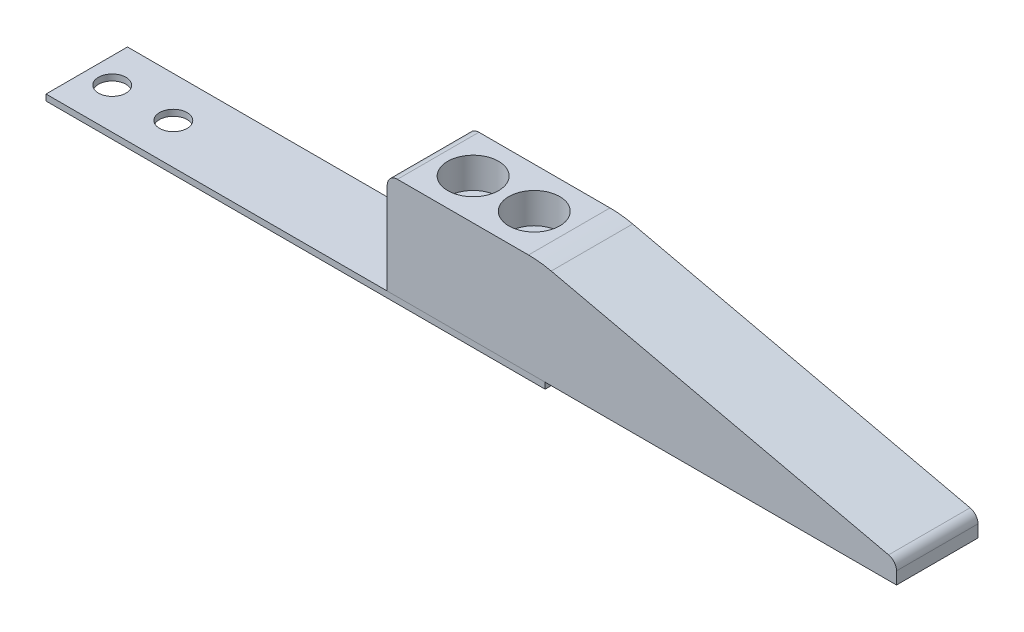
ISO-10303-21;
HEADER;
FILE_DESCRIPTION(('STEP AP214'),'2;1');
FILE_NAME('part.step','',(''),(''),'','','');
FILE_SCHEMA(('AUTOMOTIVE_DESIGN { 1 0 10303 214 1 1 1 1 }'));
ENDSEC;
DATA;
#1=APPLICATION_CONTEXT('core data for automotive mechanical design processes');
#2=APPLICATION_PROTOCOL_DEFINITION('international standard','automotive_design',2000,#1);
#3=PRODUCT_CONTEXT('',#1,'mechanical');
#4=PRODUCT('Part','Part','',(#3));
#5=PRODUCT_RELATED_PRODUCT_CATEGORY('part','',(#4));
#6=PRODUCT_DEFINITION_FORMATION('','',#4);
#7=PRODUCT_DEFINITION_CONTEXT('part definition',#1,'design');
#8=PRODUCT_DEFINITION('design','',#6,#7);
#9=PRODUCT_DEFINITION_SHAPE('','',#8);
#10=(LENGTH_UNIT() NAMED_UNIT(*) SI_UNIT(.MILLI.,.METRE.));
#11=(NAMED_UNIT(*) PLANE_ANGLE_UNIT() SI_UNIT($,.RADIAN.));
#12=(NAMED_UNIT(*) SI_UNIT($,.STERADIAN.) SOLID_ANGLE_UNIT());
#13=UNCERTAINTY_MEASURE_WITH_UNIT(LENGTH_MEASURE(1.E-05),#10,'distance_accuracy_value','');
#14=(GEOMETRIC_REPRESENTATION_CONTEXT(3) GLOBAL_UNCERTAINTY_ASSIGNED_CONTEXT((#13)) GLOBAL_UNIT_ASSIGNED_CONTEXT((#10,
#11,#12)) REPRESENTATION_CONTEXT('',''));
#15=CARTESIAN_POINT('',(0.,0.,0.));
#16=DIRECTION('',(0.,0.,1.));
#17=DIRECTION('',(1.,0.,0.));
#18=AXIS2_PLACEMENT_3D('',#15,#16,#17);
#19=CARTESIAN_POINT('',(43.9358461612297,0.,-4.));
#20=DIRECTION('',(0.,1.,0.));
#21=DIRECTION('',(0.,0.,1.));
#22=AXIS2_PLACEMENT_3D('',#19,#20,#21);
#23=CYLINDRICAL_SURFACE('',#22,1.35);
#24=CARTESIAN_POINT('',(43.9358461612297,0.6,-4.));
#25=DIRECTION('',(0.,-1.,0.));
#26=DIRECTION('',(0.,0.,-1.));
#27=AXIS2_PLACEMENT_3D('',#24,#25,#26);
#28=CIRCLE('',#27,1.35);
#29=CARTESIAN_POINT('',(43.9358461612297,0.6,-5.35));
#30=VERTEX_POINT('',#29);
#31=EDGE_CURVE('E188',#30,#30,#28,.T.);
#32=ORIENTED_EDGE('',*,*,#31,.T.);
#33=EDGE_LOOP('',(#32));
#34=FACE_BOUND('',#33,.T.);
#35=CARTESIAN_POINT('',(43.9358461612297,7.6,-4.));
#36=DIRECTION('',(0.,1.,0.));
#37=DIRECTION('',(0.,0.,1.));
#38=AXIS2_PLACEMENT_3D('',#35,#36,#37);
#39=CIRCLE('',#38,1.35);
#40=CARTESIAN_POINT('',(43.9358461612297,7.6,-2.65));
#41=VERTEX_POINT('',#40);
#42=EDGE_CURVE('E52',#41,#41,#39,.F.);
#43=ORIENTED_EDGE('',*,*,#42,.F.);
#44=EDGE_LOOP('',(#43));
#45=FACE_BOUND('',#44,.T.);
#46=ADVANCED_FACE('F48',(#34,#45),#23,.F.);
#47=CARTESIAN_POINT('',(37.9358461612297,0.,-4.));
#48=DIRECTION('',(0.,1.,0.));
#49=DIRECTION('',(0.,0.,1.));
#50=AXIS2_PLACEMENT_3D('',#47,#48,#49);
#51=CYLINDRICAL_SURFACE('',#50,1.35);
#52=CARTESIAN_POINT('',(37.9358461612297,0.6,-4.));
#53=DIRECTION('',(0.,-1.,0.));
#54=DIRECTION('',(0.,0.,-1.));
#55=AXIS2_PLACEMENT_3D('',#52,#53,#54);
#56=CIRCLE('',#55,1.35);
#57=CARTESIAN_POINT('',(37.9358461612297,0.6,-5.35));
#58=VERTEX_POINT('',#57);
#59=EDGE_CURVE('E145',#58,#58,#56,.T.);
#60=ORIENTED_EDGE('',*,*,#59,.T.);
#61=EDGE_LOOP('',(#60));
#62=FACE_BOUND('',#61,.T.);
#63=CARTESIAN_POINT('',(37.9358461612297,7.6,-4.));
#64=DIRECTION('',(0.,1.,0.));
#65=DIRECTION('',(0.,0.,1.));
#66=AXIS2_PLACEMENT_3D('',#63,#64,#65);
#67=CIRCLE('',#66,1.35);
#68=CARTESIAN_POINT('',(37.9358461612297,7.6,-2.65));
#69=VERTEX_POINT('',#68);
#70=EDGE_CURVE('E182',#69,#69,#67,.F.);
#71=ORIENTED_EDGE('',*,*,#70,.F.);
#72=EDGE_LOOP('',(#71));
#73=FACE_BOUND('',#72,.T.);
#74=ADVANCED_FACE('F208',(#62,#73),#51,.F.);
#75=CARTESIAN_POINT('',(83.5,0.6,-8.));
#76=DIRECTION('',(0.,-1.,0.));
#77=DIRECTION('',(0.,0.,-1.));
#78=AXIS2_PLACEMENT_3D('',#75,#76,#77);
#79=PLANE('',#78);
#80=ORIENTED_EDGE('',*,*,#59,.F.);
#81=EDGE_LOOP('',(#80));
#82=FACE_BOUND('',#81,.T.);
#83=ORIENTED_EDGE('',*,*,#31,.F.);
#84=EDGE_LOOP('',(#83));
#85=FACE_BOUND('',#84,.T.);
#86=DIRECTION('',(1.,0.,0.));
#87=VECTOR('',#86,1.);
#88=CARTESIAN_POINT('',(83.5,0.6,0.));
#89=LINE('',#88,#87);
#90=CARTESIAN_POINT('',(33.5,0.6,0.));
#91=VERTEX_POINT('',#90);
#92=CARTESIAN_POINT('',(83.5,0.6,0.));
#93=VERTEX_POINT('',#92);
#94=EDGE_CURVE('E154',#91,#93,#89,.T.);
#95=ORIENTED_EDGE('',*,*,#94,.F.);
#96=DIRECTION('',(0.,0.,1.));
#97=VECTOR('',#96,1.);
#98=CARTESIAN_POINT('',(33.5,0.6,-8.));
#99=LINE('',#98,#97);
#100=CARTESIAN_POINT('',(33.5,0.6,-8.));
#101=VERTEX_POINT('',#100);
#102=EDGE_CURVE('E125',#101,#91,#99,.T.);
#103=ORIENTED_EDGE('',*,*,#102,.F.);
#104=DIRECTION('',(1.,0.,0.));
#105=VECTOR('',#104,1.);
#106=CARTESIAN_POINT('',(83.5,0.6,-8.));
#107=LINE('',#106,#105);
#108=CARTESIAN_POINT('',(83.5,0.6,-8.));
#109=VERTEX_POINT('',#108);
#110=EDGE_CURVE('E131',#101,#109,#107,.T.);
#111=ORIENTED_EDGE('',*,*,#110,.T.);
#112=DIRECTION('',(0.,0.,1.));
#113=VECTOR('',#112,1.);
#114=CARTESIAN_POINT('',(83.5,0.6,-8.));
#115=LINE('',#114,#113);
#116=EDGE_CURVE('E113',#109,#93,#115,.T.);
#117=ORIENTED_EDGE('',*,*,#116,.T.);
#118=EDGE_LOOP('',(#95,#103,#111,#117));
#119=FACE_BOUND('',#118,.T.);
#120=ADVANCED_FACE('F138',(#82,#85,#119),#79,.T.);
#121=CARTESIAN_POINT('',(33.5,0.6,-8.));
#122=DIRECTION('',(-1.,0.,0.));
#123=DIRECTION('',(0.,0.,1.));
#124=AXIS2_PLACEMENT_3D('',#121,#122,#123);
#125=PLANE('',#124);
#126=DIRECTION('',(0.,-1.,0.));
#127=VECTOR('',#126,1.);
#128=CARTESIAN_POINT('',(33.5,0.6,0.));
#129=LINE('',#128,#127);
#130=CARTESIAN_POINT('',(33.5,9.6,0.));
#131=VERTEX_POINT('',#130);
#132=EDGE_CURVE('E140',#131,#91,#129,.T.);
#133=ORIENTED_EDGE('',*,*,#132,.F.);
#134=DIRECTION('',(0.,0.,1.));
#135=VECTOR('',#134,1.);
#136=CARTESIAN_POINT('',(33.5,9.6,-8.));
#137=LINE('',#136,#135);
#138=CARTESIAN_POINT('',(33.5,9.6,-8.));
#139=VERTEX_POINT('',#138);
#140=EDGE_CURVE('E57',#131,#139,#137,.F.);
#141=ORIENTED_EDGE('',*,*,#140,.T.);
#142=DIRECTION('',(0.,-1.,0.));
#143=VECTOR('',#142,1.);
#144=CARTESIAN_POINT('',(33.5,0.6,-8.));
#145=LINE('',#144,#143);
#146=EDGE_CURVE('E126',#139,#101,#145,.T.);
#147=ORIENTED_EDGE('',*,*,#146,.T.);
#148=ORIENTED_EDGE('',*,*,#102,.T.);
#149=EDGE_LOOP('',(#133,#141,#147,#148));
#150=FACE_BOUND('',#149,.T.);
#151=ADVANCED_FACE('F213',(#150),#125,.T.);
#152=CARTESIAN_POINT('',(33.5,10.6,-8.));
#153=DIRECTION('',(0.,1.,0.));
#154=DIRECTION('',(0.,0.,1.));
#155=AXIS2_PLACEMENT_3D('',#152,#153,#154);
#156=PLANE('',#155);
#157=CARTESIAN_POINT('',(37.9358461612297,10.6,-4.));
#158=DIRECTION('',(0.,1.,0.));
#159=DIRECTION('',(0.,0.,1.));
#160=AXIS2_PLACEMENT_3D('',#157,#158,#159);
#161=CIRCLE('',#160,2.5);
#162=CARTESIAN_POINT('',(37.9358461612297,10.6,-1.5));
#163=VERTEX_POINT('',#162);
#164=EDGE_CURVE('E190',#163,#163,#161,.T.);
#165=ORIENTED_EDGE('',*,*,#164,.F.);
#166=EDGE_LOOP('',(#165));
#167=FACE_BOUND('',#166,.T.);
#168=CARTESIAN_POINT('',(43.9358461612297,10.6,-4.));
#169=DIRECTION('',(0.,1.,0.));
#170=DIRECTION('',(0.,0.,1.));
#171=AXIS2_PLACEMENT_3D('',#168,#169,#170);
#172=CIRCLE('',#171,2.5);
#173=CARTESIAN_POINT('',(43.9358461612297,10.6,-1.5));
#174=VERTEX_POINT('',#173);
#175=EDGE_CURVE('E200',#174,#174,#172,.T.);
#176=ORIENTED_EDGE('',*,*,#175,.F.);
#177=EDGE_LOOP('',(#176));
#178=FACE_BOUND('',#177,.T.);
#179=DIRECTION('',(-1.,0.,0.));
#180=VECTOR('',#179,1.);
#181=CARTESIAN_POINT('',(33.5,10.6,-8.));
#182=LINE('',#181,#180);
#183=CARTESIAN_POINT('',(47.3716923224594,10.6,-8.));
#184=VERTEX_POINT('',#183);
#185=CARTESIAN_POINT('',(34.5,10.6,-8.));
#186=VERTEX_POINT('',#185);
#187=EDGE_CURVE('E150',#184,#186,#182,.T.);
#188=ORIENTED_EDGE('',*,*,#187,.T.);
#189=DIRECTION('',(0.,0.,1.));
#190=VECTOR('',#189,1.);
#191=CARTESIAN_POINT('',(34.5,10.6,-8.));
#192=LINE('',#191,#190);
#193=CARTESIAN_POINT('',(34.5,10.6,0.));
#194=VERTEX_POINT('',#193);
#195=EDGE_CURVE('E178',#186,#194,#192,.T.);
#196=ORIENTED_EDGE('',*,*,#195,.T.);
#197=DIRECTION('',(-1.,0.,0.));
#198=VECTOR('',#197,1.);
#199=CARTESIAN_POINT('',(33.5,10.6,0.));
#200=LINE('',#199,#198);
#201=CARTESIAN_POINT('',(47.3716923224594,10.6,0.));
#202=VERTEX_POINT('',#201);
#203=EDGE_CURVE('E142',#202,#194,#200,.T.);
#204=ORIENTED_EDGE('',*,*,#203,.F.);
#205=DIRECTION('',(0.,0.,1.));
#206=VECTOR('',#205,1.);
#207=CARTESIAN_POINT('',(47.3716923224594,10.6,-8.));
#208=LINE('',#207,#206);
#209=EDGE_CURVE('E174',#202,#184,#208,.F.);
#210=ORIENTED_EDGE('',*,*,#209,.T.);
#211=EDGE_LOOP('',(#188,#196,#204,#210));
#212=FACE_BOUND('',#211,.T.);
#213=ADVANCED_FACE('F219',(#167,#178,#212),#156,.T.);
#214=CARTESIAN_POINT('',(83.5,2.6,-8.));
#215=DIRECTION('',(0.222824801502141,0.974858506571867,0.));
#216=DIRECTION('',(-0.974858506571867,0.222824801502141,0.));
#217=AXIS2_PLACEMENT_3D('',#214,#215,#216);
#218=PLANE('',#217);
#219=DIRECTION('',(-0.974858506571867,0.222824801502141,0.));
#220=VECTOR('',#219,1.);
#221=CARTESIAN_POINT('',(83.5,2.6,-8.));
#222=LINE('',#221,#220);
#223=CARTESIAN_POINT('',(82.7228248015021,2.77764004537094,-8.));
#224=VERTEX_POINT('',#223);
#225=CARTESIAN_POINT('',(49.5999403374808,10.3485850657187,-8.));
#226=VERTEX_POINT('',#225);
#227=EDGE_CURVE('E135',#224,#226,#222,.T.);
#228=ORIENTED_EDGE('',*,*,#227,.T.);
#229=DIRECTION('',(0.,0.,1.));
#230=VECTOR('',#229,1.);
#231=CARTESIAN_POINT('',(49.5999403374808,10.3485850657187,-8.));
#232=LINE('',#231,#230);
#233=CARTESIAN_POINT('',(49.5999403374808,10.3485850657187,0.));
#234=VERTEX_POINT('',#233);
#235=EDGE_CURVE('E169',#226,#234,#232,.T.);
#236=ORIENTED_EDGE('',*,*,#235,.T.);
#237=DIRECTION('',(-0.974858506571867,0.222824801502141,0.));
#238=VECTOR('',#237,1.);
#239=CARTESIAN_POINT('',(83.5,2.6,0.));
#240=LINE('',#239,#238);
#241=CARTESIAN_POINT('',(82.7228248015021,2.77764004537094,0.));
#242=VERTEX_POINT('',#241);
#243=EDGE_CURVE('E157',#242,#234,#240,.T.);
#244=ORIENTED_EDGE('',*,*,#243,.F.);
#245=DIRECTION('',(0.,0.,1.));
#246=VECTOR('',#245,1.);
#247=CARTESIAN_POINT('',(82.7228248015021,2.77764004537094,-8.));
#248=LINE('',#247,#246);
#249=EDGE_CURVE('E166',#242,#224,#248,.F.);
#250=ORIENTED_EDGE('',*,*,#249,.T.);
#251=EDGE_LOOP('',(#228,#236,#244,#250));
#252=FACE_BOUND('',#251,.T.);
#253=ADVANCED_FACE('F239',(#252),#218,.T.);
#254=CARTESIAN_POINT('',(83.5,0.6,-8.));
#255=DIRECTION('',(1.,0.,0.));
#256=DIRECTION('',(0.,0.,-1.));
#257=AXIS2_PLACEMENT_3D('',#254,#255,#256);
#258=PLANE('',#257);
#259=DIRECTION('',(0.,1.,0.));
#260=VECTOR('',#259,1.);
#261=CARTESIAN_POINT('',(83.5,0.6,-8.));
#262=LINE('',#261,#260);
#263=CARTESIAN_POINT('',(83.5,1.80278153879907,-8.));
#264=VERTEX_POINT('',#263);
#265=EDGE_CURVE('E117',#109,#264,#262,.T.);
#266=ORIENTED_EDGE('',*,*,#265,.T.);
#267=DIRECTION('',(0.,0.,1.));
#268=VECTOR('',#267,1.);
#269=CARTESIAN_POINT('',(83.5,1.80278153879907,-8.));
#270=LINE('',#269,#268);
#271=CARTESIAN_POINT('',(83.5,1.80278153879907,0.));
#272=VERTEX_POINT('',#271);
#273=EDGE_CURVE('E161',#264,#272,#270,.T.);
#274=ORIENTED_EDGE('',*,*,#273,.T.);
#275=DIRECTION('',(0.,1.,0.));
#276=VECTOR('',#275,1.);
#277=CARTESIAN_POINT('',(83.5,0.6,0.));
#278=LINE('',#277,#276);
#279=EDGE_CURVE('E120',#93,#272,#278,.T.);
#280=ORIENTED_EDGE('',*,*,#279,.F.);
#281=ORIENTED_EDGE('',*,*,#116,.F.);
#282=EDGE_LOOP('',(#266,#274,#280,#281));
#283=FACE_BOUND('',#282,.T.);
#284=ADVANCED_FACE('F115',(#283),#258,.T.);
#285=CARTESIAN_POINT('',(0.,0.,-8.));
#286=DIRECTION('',(0.,0.,-1.));
#287=DIRECTION('',(-1.,0.,0.));
#288=AXIS2_PLACEMENT_3D('',#285,#286,#287);
#289=PLANE('',#288);
#290=ORIENTED_EDGE('',*,*,#146,.F.);
#291=CARTESIAN_POINT('',(34.5,9.6,-8.));
#292=DIRECTION('',(0.,0.,-1.));
#293=DIRECTION('',(-1.,0.,0.));
#294=AXIS2_PLACEMENT_3D('',#291,#292,#293);
#295=CIRCLE('',#294,1.);
#296=EDGE_CURVE('E12',#139,#186,#295,.T.);
#297=ORIENTED_EDGE('',*,*,#296,.T.);
#298=ORIENTED_EDGE('',*,*,#187,.F.);
#299=CARTESIAN_POINT('',(47.3716923224594,0.599999999999999,-8.));
#300=DIRECTION('',(0.,0.,-1.));
#301=DIRECTION('',(-1.,0.,0.));
#302=AXIS2_PLACEMENT_3D('',#299,#300,#301);
#303=CIRCLE('',#302,10.);
#304=EDGE_CURVE('E176',#184,#226,#303,.T.);
#305=ORIENTED_EDGE('',*,*,#304,.T.);
#306=ORIENTED_EDGE('',*,*,#227,.F.);
#307=CARTESIAN_POINT('',(82.5,1.80278153879907,-8.));
#308=DIRECTION('',(0.,0.,-1.));
#309=DIRECTION('',(-1.,0.,0.));
#310=AXIS2_PLACEMENT_3D('',#307,#308,#309);
#311=CIRCLE('',#310,1.);
#312=EDGE_CURVE('E134',#224,#264,#311,.T.);
#313=ORIENTED_EDGE('',*,*,#312,.T.);
#314=ORIENTED_EDGE('',*,*,#265,.F.);
#315=ORIENTED_EDGE('',*,*,#110,.F.);
#316=EDGE_LOOP('',(#290,#297,#298,#305,#306,#313,#314,#315));
#317=FACE_BOUND('',#316,.T.);
#318=ADVANCED_FACE('F130',(#317),#289,.T.);
#319=CARTESIAN_POINT('',(0.,0.,0.));
#320=DIRECTION('',(0.,0.,-1.));
#321=DIRECTION('',(-1.,0.,0.));
#322=AXIS2_PLACEMENT_3D('',#319,#320,#321);
#323=PLANE('',#322);
#324=ORIENTED_EDGE('',*,*,#203,.T.);
#325=CARTESIAN_POINT('',(34.5,9.6,0.));
#326=DIRECTION('',(0.,0.,-1.));
#327=DIRECTION('',(-1.,0.,0.));
#328=AXIS2_PLACEMENT_3D('',#325,#326,#327);
#329=CIRCLE('',#328,1.);
#330=EDGE_CURVE('E72',#194,#131,#329,.F.);
#331=ORIENTED_EDGE('',*,*,#330,.T.);
#332=ORIENTED_EDGE('',*,*,#132,.T.);
#333=ORIENTED_EDGE('',*,*,#94,.T.);
#334=ORIENTED_EDGE('',*,*,#279,.T.);
#335=CARTESIAN_POINT('',(82.5,1.80278153879907,0.));
#336=DIRECTION('',(0.,0.,-1.));
#337=DIRECTION('',(-1.,0.,0.));
#338=AXIS2_PLACEMENT_3D('',#335,#336,#337);
#339=CIRCLE('',#338,1.);
#340=EDGE_CURVE('E164',#272,#242,#339,.F.);
#341=ORIENTED_EDGE('',*,*,#340,.T.);
#342=ORIENTED_EDGE('',*,*,#243,.T.);
#343=CARTESIAN_POINT('',(47.3716923224594,0.599999999999999,0.));
#344=DIRECTION('',(0.,0.,-1.));
#345=DIRECTION('',(-1.,0.,0.));
#346=AXIS2_PLACEMENT_3D('',#343,#344,#345);
#347=CIRCLE('',#346,10.);
#348=EDGE_CURVE('E172',#234,#202,#347,.F.);
#349=ORIENTED_EDGE('',*,*,#348,.T.);
#350=EDGE_LOOP('',(#324,#331,#332,#333,#334,#341,#342,#349));
#351=FACE_BOUND('',#350,.T.);
#352=ADVANCED_FACE('F233',(#351),#323,.F.);
#353=CARTESIAN_POINT('',(82.5,1.80278153879907,-8.));
#354=DIRECTION('',(0.,0.,1.));
#355=DIRECTION('',(1.,0.,0.));
#356=AXIS2_PLACEMENT_3D('',#353,#354,#355);
#357=CYLINDRICAL_SURFACE('',#356,1.);
#358=ORIENTED_EDGE('',*,*,#312,.F.);
#359=ORIENTED_EDGE('',*,*,#249,.F.);
#360=ORIENTED_EDGE('',*,*,#340,.F.);
#361=ORIENTED_EDGE('',*,*,#273,.F.);
#362=EDGE_LOOP('',(#358,#359,#360,#361));
#363=FACE_BOUND('',#362,.T.);
#364=ADVANCED_FACE('F235',(#363),#357,.T.);
#365=CARTESIAN_POINT('',(47.3716923224594,0.599999999999999,-8.));
#366=DIRECTION('',(0.,0.,1.));
#367=DIRECTION('',(1.,0.,0.));
#368=AXIS2_PLACEMENT_3D('',#365,#366,#367);
#369=CYLINDRICAL_SURFACE('',#368,10.);
#370=ORIENTED_EDGE('',*,*,#304,.F.);
#371=ORIENTED_EDGE('',*,*,#209,.F.);
#372=ORIENTED_EDGE('',*,*,#348,.F.);
#373=ORIENTED_EDGE('',*,*,#235,.F.);
#374=EDGE_LOOP('',(#370,#371,#372,#373));
#375=FACE_BOUND('',#374,.T.);
#376=ADVANCED_FACE('F264',(#375),#369,.T.);
#377=CARTESIAN_POINT('',(34.5,9.6,-8.));
#378=DIRECTION('',(0.,0.,1.));
#379=DIRECTION('',(1.,0.,0.));
#380=AXIS2_PLACEMENT_3D('',#377,#378,#379);
#381=CYLINDRICAL_SURFACE('',#380,1.);
#382=ORIENTED_EDGE('',*,*,#296,.F.);
#383=ORIENTED_EDGE('',*,*,#140,.F.);
#384=ORIENTED_EDGE('',*,*,#330,.F.);
#385=ORIENTED_EDGE('',*,*,#195,.F.);
#386=EDGE_LOOP('',(#382,#383,#384,#385));
#387=FACE_BOUND('',#386,.T.);
#388=ADVANCED_FACE('F50',(#387),#381,.T.);
#389=CARTESIAN_POINT('',(37.9358461612297,7.6,-4.));
#390=DIRECTION('',(0.,1.,0.));
#391=DIRECTION('',(0.,0.,1.));
#392=AXIS2_PLACEMENT_3D('',#389,#390,#391);
#393=PLANE('',#392);
#394=CARTESIAN_POINT('',(37.9358461612297,7.6,-4.));
#395=DIRECTION('',(0.,1.,0.));
#396=DIRECTION('',(0.,0.,1.));
#397=AXIS2_PLACEMENT_3D('',#394,#395,#396);
#398=CIRCLE('',#397,2.5);
#399=CARTESIAN_POINT('',(37.9358461612297,7.6,-1.5));
#400=VERTEX_POINT('',#399);
#401=EDGE_CURVE('E184',#400,#400,#398,.T.);
#402=ORIENTED_EDGE('',*,*,#401,.T.);
#403=EDGE_LOOP('',(#402));
#404=FACE_BOUND('',#403,.T.);
#405=ORIENTED_EDGE('',*,*,#70,.T.);
#406=EDGE_LOOP('',(#405));
#407=FACE_BOUND('',#406,.T.);
#408=ADVANCED_FACE('F276',(#404,#407),#393,.T.);
#409=CARTESIAN_POINT('',(37.9358461612297,7.6,-4.));
#410=DIRECTION('',(0.,1.,0.));
#411=DIRECTION('',(0.,0.,1.));
#412=AXIS2_PLACEMENT_3D('',#409,#410,#411);
#413=CYLINDRICAL_SURFACE('',#412,2.5);
#414=ORIENTED_EDGE('',*,*,#401,.F.);
#415=EDGE_LOOP('',(#414));
#416=FACE_BOUND('',#415,.T.);
#417=ORIENTED_EDGE('',*,*,#164,.T.);
#418=EDGE_LOOP('',(#417));
#419=FACE_BOUND('',#418,.T.);
#420=ADVANCED_FACE('F283',(#416,#419),#413,.F.);
#421=CARTESIAN_POINT('',(43.9358461612297,7.6,-4.));
#422=DIRECTION('',(0.,1.,0.));
#423=DIRECTION('',(0.,0.,1.));
#424=AXIS2_PLACEMENT_3D('',#421,#422,#423);
#425=PLANE('',#424);
#426=CARTESIAN_POINT('',(43.9358461612297,7.6,-4.));
#427=DIRECTION('',(0.,1.,0.));
#428=DIRECTION('',(0.,0.,1.));
#429=AXIS2_PLACEMENT_3D('',#426,#427,#428);
#430=CIRCLE('',#429,2.5);
#431=CARTESIAN_POINT('',(43.9358461612297,7.6,-1.5));
#432=VERTEX_POINT('',#431);
#433=EDGE_CURVE('E195',#432,#432,#430,.T.);
#434=ORIENTED_EDGE('',*,*,#433,.T.);
#435=EDGE_LOOP('',(#434));
#436=FACE_BOUND('',#435,.T.);
#437=ORIENTED_EDGE('',*,*,#42,.T.);
#438=EDGE_LOOP('',(#437));
#439=FACE_BOUND('',#438,.T.);
#440=ADVANCED_FACE('F291',(#436,#439),#425,.T.);
#441=CARTESIAN_POINT('',(43.9358461612297,7.6,-4.));
#442=DIRECTION('',(0.,1.,0.));
#443=DIRECTION('',(0.,0.,1.));
#444=AXIS2_PLACEMENT_3D('',#441,#442,#443);
#445=CYLINDRICAL_SURFACE('',#444,2.5);
#446=ORIENTED_EDGE('',*,*,#433,.F.);
#447=EDGE_LOOP('',(#446));
#448=FACE_BOUND('',#447,.T.);
#449=ORIENTED_EDGE('',*,*,#175,.T.);
#450=EDGE_LOOP('',(#449));
#451=FACE_BOUND('',#450,.T.);
#452=ADVANCED_FACE('F299',(#448,#451),#445,.F.);
#453=CLOSED_SHELL('',(#46,#74,#120,#151,#213,#253,#284,#318,#352,#364,#376,#388,#408,#420,#440,#452));
#454=MANIFOLD_SOLID_BREP('B2',#453);
#455=CARTESIAN_POINT('',(0.,0.6,0.));
#456=DIRECTION('',(0.,-1.,0.));
#457=DIRECTION('',(0.,0.,-1.));
#458=AXIS2_PLACEMENT_3D('',#455,#456,#457);
#459=PLANE('',#458);
#460=CARTESIAN_POINT('',(37.9358461612297,0.6,-4.));
#461=DIRECTION('',(0.,-1.,0.));
#462=DIRECTION('',(0.,0.,-1.));
#463=AXIS2_PLACEMENT_3D('',#460,#461,#462);
#464=CIRCLE('',#463,1.35);
#465=CARTESIAN_POINT('',(37.9358461612297,0.6,-5.35));
#466=VERTEX_POINT('',#465);
#467=EDGE_CURVE('E465',#466,#466,#464,.T.);
#468=ORIENTED_EDGE('',*,*,#467,.T.);
#469=EDGE_LOOP('',(#468));
#470=FACE_BOUND('',#469,.T.);
#471=CARTESIAN_POINT('',(43.9358461612297,0.6,-4.));
#472=DIRECTION('',(0.,-1.,0.));
#473=DIRECTION('',(0.,0.,-1.));
#474=AXIS2_PLACEMENT_3D('',#471,#472,#473);
#475=CIRCLE('',#474,1.35);
#476=CARTESIAN_POINT('',(43.9358461612297,0.6,-5.35));
#477=VERTEX_POINT('',#476);
#478=EDGE_CURVE('E470',#477,#477,#475,.T.);
#479=ORIENTED_EDGE('',*,*,#478,.T.);
#480=EDGE_LOOP('',(#479));
#481=FACE_BOUND('',#480,.T.);
#482=DIRECTION('',(0.,0.,1.));
#483=VECTOR('',#482,1.);
#484=CARTESIAN_POINT('',(0.,0.6,0.));
#485=LINE('',#484,#483);
#486=CARTESIAN_POINT('',(0.,0.6,-8.));
#487=VERTEX_POINT('',#486);
#488=CARTESIAN_POINT('',(0.,0.6,0.));
#489=VERTEX_POINT('',#488);
#490=EDGE_CURVE('E429',#487,#489,#485,.T.);
#491=ORIENTED_EDGE('',*,*,#490,.T.);
#492=DIRECTION('',(1.,0.,0.));
#493=VECTOR('',#492,1.);
#494=CARTESIAN_POINT('',(0.,0.6,0.));
#495=LINE('',#494,#493);
#496=CARTESIAN_POINT('',(49.,0.6,0.));
#497=VERTEX_POINT('',#496);
#498=EDGE_CURVE('E424',#489,#497,#495,.T.);
#499=ORIENTED_EDGE('',*,*,#498,.T.);
#500=DIRECTION('',(0.,0.,-1.));
#501=VECTOR('',#500,1.);
#502=CARTESIAN_POINT('',(49.,0.6,0.));
#503=LINE('',#502,#501);
#504=CARTESIAN_POINT('',(49.,0.6,-8.));
#505=VERTEX_POINT('',#504);
#506=EDGE_CURVE('E427',#497,#505,#503,.T.);
#507=ORIENTED_EDGE('',*,*,#506,.T.);
#508=DIRECTION('',(-1.,0.,0.));
#509=VECTOR('',#508,1.);
#510=CARTESIAN_POINT('',(0.,0.6,-8.));
#511=LINE('',#510,#509);
#512=EDGE_CURVE('E394',#505,#487,#511,.T.);
#513=ORIENTED_EDGE('',*,*,#512,.T.);
#514=EDGE_LOOP('',(#491,#499,#507,#513));
#515=FACE_BOUND('',#514,.T.);
#516=CARTESIAN_POINT('',(2.5,0.6,-4.));
#517=DIRECTION('',(0.,1.,0.));
#518=DIRECTION('',(0.,0.,1.));
#519=AXIS2_PLACEMENT_3D('',#516,#517,#518);
#520=CIRCLE('',#519,1.35);
#521=CARTESIAN_POINT('',(2.5,0.6,-2.65));
#522=VERTEX_POINT('',#521);
#523=EDGE_CURVE('E444',#522,#522,#520,.T.);
#524=ORIENTED_EDGE('',*,*,#523,.F.);
#525=EDGE_LOOP('',(#524));
#526=FACE_BOUND('',#525,.T.);
#527=CARTESIAN_POINT('',(8.5,0.6,-4.));
#528=DIRECTION('',(0.,1.,0.));
#529=DIRECTION('',(0.,0.,1.));
#530=AXIS2_PLACEMENT_3D('',#527,#528,#529);
#531=CIRCLE('',#530,1.35);
#532=CARTESIAN_POINT('',(8.5,0.6,-2.65));
#533=VERTEX_POINT('',#532);
#534=EDGE_CURVE('E459',#533,#533,#531,.T.);
#535=ORIENTED_EDGE('',*,*,#534,.F.);
#536=EDGE_LOOP('',(#535));
#537=FACE_BOUND('',#536,.T.);
#538=ADVANCED_FACE('F377',(#470,#481,#515,#526,#537),#459,.F.);
#539=CARTESIAN_POINT('',(0.,0.,0.));
#540=DIRECTION('',(0.,-1.,0.));
#541=DIRECTION('',(0.,0.,-1.));
#542=AXIS2_PLACEMENT_3D('',#539,#540,#541);
#543=PLANE('',#542);
#544=CARTESIAN_POINT('',(37.9358461612297,0.,-4.));
#545=DIRECTION('',(0.,1.,0.));
#546=DIRECTION('',(0.,0.,1.));
#547=AXIS2_PLACEMENT_3D('',#544,#545,#546);
#548=CIRCLE('',#547,1.35);
#549=CARTESIAN_POINT('',(37.9358461612297,0.,-2.65));
#550=VERTEX_POINT('',#549);
#551=EDGE_CURVE('E473',#550,#550,#548,.T.);
#552=ORIENTED_EDGE('',*,*,#551,.T.);
#553=EDGE_LOOP('',(#552));
#554=FACE_BOUND('',#553,.T.);
#555=CARTESIAN_POINT('',(43.9358461612297,0.,-4.));
#556=DIRECTION('',(0.,1.,0.));
#557=DIRECTION('',(0.,0.,-1.));
#558=AXIS2_PLACEMENT_3D('',#555,#556,#557);
#559=CIRCLE('',#558,1.35);
#560=CARTESIAN_POINT('',(43.9358461612297,0.,-5.35));
#561=VERTEX_POINT('',#560);
#562=EDGE_CURVE('E474',#561,#561,#559,.T.);
#563=ORIENTED_EDGE('',*,*,#562,.T.);
#564=EDGE_LOOP('',(#563));
#565=FACE_BOUND('',#564,.T.);
#566=CARTESIAN_POINT('',(2.5,0.,-4.));
#567=DIRECTION('',(0.,1.,0.));
#568=DIRECTION('',(0.,0.,1.));
#569=AXIS2_PLACEMENT_3D('',#566,#567,#568);
#570=CIRCLE('',#569,1.35);
#571=CARTESIAN_POINT('',(2.5,0.,-2.65));
#572=VERTEX_POINT('',#571);
#573=EDGE_CURVE('E456',#572,#572,#570,.T.);
#574=ORIENTED_EDGE('',*,*,#573,.T.);
#575=EDGE_LOOP('',(#574));
#576=FACE_BOUND('',#575,.T.);
#577=DIRECTION('',(0.,0.,1.));
#578=VECTOR('',#577,1.);
#579=CARTESIAN_POINT('',(0.,0.,0.));
#580=LINE('',#579,#578);
#581=CARTESIAN_POINT('',(0.,0.,-8.));
#582=VERTEX_POINT('',#581);
#583=CARTESIAN_POINT('',(0.,0.,0.));
#584=VERTEX_POINT('',#583);
#585=EDGE_CURVE('E441',#582,#584,#580,.T.);
#586=ORIENTED_EDGE('',*,*,#585,.F.);
#587=DIRECTION('',(-1.,0.,0.));
#588=VECTOR('',#587,1.);
#589=CARTESIAN_POINT('',(0.,0.,-8.));
#590=LINE('',#589,#588);
#591=CARTESIAN_POINT('',(49.,0.,-8.));
#592=VERTEX_POINT('',#591);
#593=EDGE_CURVE('E417',#592,#582,#590,.T.);
#594=ORIENTED_EDGE('',*,*,#593,.F.);
#595=DIRECTION('',(0.,0.,-1.));
#596=VECTOR('',#595,1.);
#597=CARTESIAN_POINT('',(49.,0.,0.));
#598=LINE('',#597,#596);
#599=CARTESIAN_POINT('',(49.,0.,0.));
#600=VERTEX_POINT('',#599);
#601=EDGE_CURVE('E411',#600,#592,#598,.T.);
#602=ORIENTED_EDGE('',*,*,#601,.F.);
#603=DIRECTION('',(1.,0.,0.));
#604=VECTOR('',#603,1.);
#605=CARTESIAN_POINT('',(0.,0.,0.));
#606=LINE('',#605,#604);
#607=EDGE_CURVE('E433',#584,#600,#606,.T.);
#608=ORIENTED_EDGE('',*,*,#607,.F.);
#609=EDGE_LOOP('',(#586,#594,#602,#608));
#610=FACE_BOUND('',#609,.T.);
#611=CARTESIAN_POINT('',(8.5,0.,-4.));
#612=DIRECTION('',(0.,1.,0.));
#613=DIRECTION('',(0.,0.,1.));
#614=AXIS2_PLACEMENT_3D('',#611,#612,#613);
#615=CIRCLE('',#614,1.35);
#616=CARTESIAN_POINT('',(8.5,0.,-2.65));
#617=VERTEX_POINT('',#616);
#618=EDGE_CURVE('E462',#617,#617,#615,.T.);
#619=ORIENTED_EDGE('',*,*,#618,.T.);
#620=EDGE_LOOP('',(#619));
#621=FACE_BOUND('',#620,.T.);
#622=ADVANCED_FACE('F452',(#554,#565,#576,#610,#621),#543,.T.);
#623=CARTESIAN_POINT('',(0.,0.6,0.));
#624=DIRECTION('',(1.,0.,0.));
#625=DIRECTION('',(0.,0.,-1.));
#626=AXIS2_PLACEMENT_3D('',#623,#624,#625);
#627=PLANE('',#626);
#628=ORIENTED_EDGE('',*,*,#585,.T.);
#629=DIRECTION('',(0.,-1.,0.));
#630=VECTOR('',#629,1.);
#631=CARTESIAN_POINT('',(0.,0.6,0.));
#632=LINE('',#631,#630);
#633=EDGE_CURVE('E46',#489,#584,#632,.T.);
#634=ORIENTED_EDGE('',*,*,#633,.F.);
#635=ORIENTED_EDGE('',*,*,#490,.F.);
#636=DIRECTION('',(0.,-1.,0.));
#637=VECTOR('',#636,1.);
#638=CARTESIAN_POINT('',(0.,0.6,-8.));
#639=LINE('',#638,#637);
#640=EDGE_CURVE('E437',#487,#582,#639,.T.);
#641=ORIENTED_EDGE('',*,*,#640,.T.);
#642=EDGE_LOOP('',(#628,#634,#635,#641));
#643=FACE_BOUND('',#642,.T.);
#644=ADVANCED_FACE('F379',(#643),#627,.F.);
#645=CARTESIAN_POINT('',(0.,0.6,0.));
#646=DIRECTION('',(0.,0.,-1.));
#647=DIRECTION('',(-1.,0.,0.));
#648=AXIS2_PLACEMENT_3D('',#645,#646,#647);
#649=PLANE('',#648);
#650=ORIENTED_EDGE('',*,*,#607,.T.);
#651=DIRECTION('',(0.,-1.,0.));
#652=VECTOR('',#651,1.);
#653=CARTESIAN_POINT('',(49.,0.6,0.));
#654=LINE('',#653,#652);
#655=EDGE_CURVE('E386',#497,#600,#654,.T.);
#656=ORIENTED_EDGE('',*,*,#655,.F.);
#657=ORIENTED_EDGE('',*,*,#498,.F.);
#658=ORIENTED_EDGE('',*,*,#633,.T.);
#659=EDGE_LOOP('',(#650,#656,#657,#658));
#660=FACE_BOUND('',#659,.T.);
#661=ADVANCED_FACE('F432',(#660),#649,.F.);
#662=CARTESIAN_POINT('',(49.,0.6,0.));
#663=DIRECTION('',(-1.,0.,0.));
#664=DIRECTION('',(0.,0.,1.));
#665=AXIS2_PLACEMENT_3D('',#662,#663,#664);
#666=PLANE('',#665);
#667=ORIENTED_EDGE('',*,*,#601,.T.);
#668=DIRECTION('',(0.,-1.,0.));
#669=VECTOR('',#668,1.);
#670=CARTESIAN_POINT('',(49.,0.6,-8.));
#671=LINE('',#670,#669);
#672=EDGE_CURVE('E434',#505,#592,#671,.T.);
#673=ORIENTED_EDGE('',*,*,#672,.F.);
#674=ORIENTED_EDGE('',*,*,#506,.F.);
#675=ORIENTED_EDGE('',*,*,#655,.T.);
#676=EDGE_LOOP('',(#667,#673,#674,#675));
#677=FACE_BOUND('',#676,.T.);
#678=ADVANCED_FACE('F435',(#677),#666,.F.);
#679=CARTESIAN_POINT('',(0.,0.6,-8.));
#680=DIRECTION('',(0.,0.,1.));
#681=DIRECTION('',(1.,0.,0.));
#682=AXIS2_PLACEMENT_3D('',#679,#680,#681);
#683=PLANE('',#682);
#684=ORIENTED_EDGE('',*,*,#593,.T.);
#685=ORIENTED_EDGE('',*,*,#640,.F.);
#686=ORIENTED_EDGE('',*,*,#512,.F.);
#687=ORIENTED_EDGE('',*,*,#672,.T.);
#688=EDGE_LOOP('',(#684,#685,#686,#687));
#689=FACE_BOUND('',#688,.T.);
#690=ADVANCED_FACE('F449',(#689),#683,.F.);
#691=CARTESIAN_POINT('',(2.5,0.6,-4.));
#692=DIRECTION('',(0.,-1.,0.));
#693=DIRECTION('',(0.,0.,-1.));
#694=AXIS2_PLACEMENT_3D('',#691,#692,#693);
#695=CYLINDRICAL_SURFACE('',#694,1.35);
#696=ORIENTED_EDGE('',*,*,#523,.T.);
#697=EDGE_LOOP('',(#696));
#698=FACE_BOUND('',#697,.T.);
#699=ORIENTED_EDGE('',*,*,#573,.F.);
#700=EDGE_LOOP('',(#699));
#701=FACE_BOUND('',#700,.T.);
#702=ADVANCED_FACE('F501',(#698,#701),#695,.F.);
#703=CARTESIAN_POINT('',(8.5,0.6,-4.));
#704=DIRECTION('',(0.,-1.,0.));
#705=DIRECTION('',(0.,0.,-1.));
#706=AXIS2_PLACEMENT_3D('',#703,#704,#705);
#707=CYLINDRICAL_SURFACE('',#706,1.35);
#708=ORIENTED_EDGE('',*,*,#534,.T.);
#709=EDGE_LOOP('',(#708));
#710=FACE_BOUND('',#709,.T.);
#711=ORIENTED_EDGE('',*,*,#618,.F.);
#712=EDGE_LOOP('',(#711));
#713=FACE_BOUND('',#712,.T.);
#714=ADVANCED_FACE('F495',(#710,#713),#707,.F.);
#715=CARTESIAN_POINT('',(43.9358461612297,0.,-4.));
#716=DIRECTION('',(0.,1.,0.));
#717=DIRECTION('',(0.,0.,1.));
#718=AXIS2_PLACEMENT_3D('',#715,#716,#717);
#719=CYLINDRICAL_SURFACE('',#718,1.35);
#720=ORIENTED_EDGE('',*,*,#562,.F.);
#721=EDGE_LOOP('',(#720));
#722=FACE_BOUND('',#721,.T.);
#723=ORIENTED_EDGE('',*,*,#478,.F.);
#724=EDGE_LOOP('',(#723));
#725=FACE_BOUND('',#724,.T.);
#726=ADVANCED_FACE('F485',(#722,#725),#719,.F.);
#727=CARTESIAN_POINT('',(37.9358461612297,0.,-4.));
#728=DIRECTION('',(0.,1.,0.));
#729=DIRECTION('',(0.,0.,1.));
#730=AXIS2_PLACEMENT_3D('',#727,#728,#729);
#731=CYLINDRICAL_SURFACE('',#730,1.35);
#732=ORIENTED_EDGE('',*,*,#551,.F.);
#733=EDGE_LOOP('',(#732));
#734=FACE_BOUND('',#733,.T.);
#735=ORIENTED_EDGE('',*,*,#467,.F.);
#736=EDGE_LOOP('',(#735));
#737=FACE_BOUND('',#736,.T.);
#738=ADVANCED_FACE('F482',(#734,#737),#731,.F.);
#739=CLOSED_SHELL('',(#538,#622,#644,#661,#678,#690,#702,#714,#726,#738));
#740=MANIFOLD_SOLID_BREP('B6',#739);
#741=ADVANCED_BREP_SHAPE_REPRESENTATION('',(#18,#454,#740),#14);
#742=SHAPE_DEFINITION_REPRESENTATION(#9,#741);
ENDSEC;
END-ISO-10303-21;
